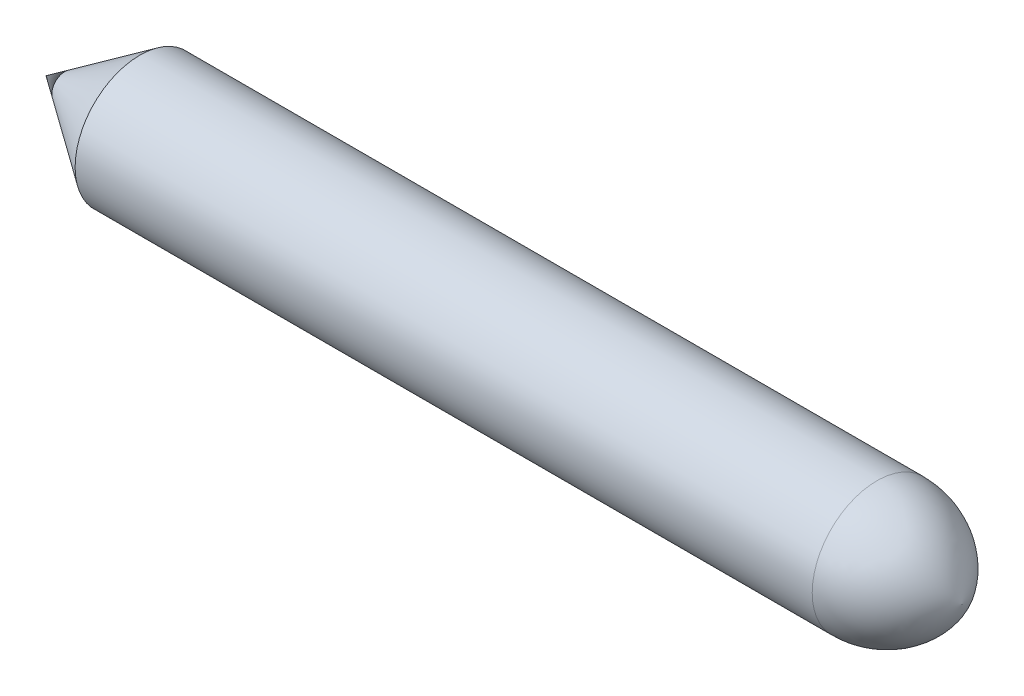
ISO-10303-21;
HEADER;
FILE_DESCRIPTION(('STEP AP214'),'2;1');
FILE_NAME('part.step','',(''),(''),'','','');
FILE_SCHEMA(('AUTOMOTIVE_DESIGN { 1 0 10303 214 1 1 1 1 }'));
ENDSEC;
DATA;
#1=APPLICATION_CONTEXT('core data for automotive mechanical design processes');
#2=APPLICATION_PROTOCOL_DEFINITION('international standard','automotive_design',2000,#1);
#3=PRODUCT_CONTEXT('',#1,'mechanical');
#4=PRODUCT('Part','Part','',(#3));
#5=PRODUCT_RELATED_PRODUCT_CATEGORY('part','',(#4));
#6=PRODUCT_DEFINITION_FORMATION('','',#4);
#7=PRODUCT_DEFINITION_CONTEXT('part definition',#1,'design');
#8=PRODUCT_DEFINITION('design','',#6,#7);
#9=PRODUCT_DEFINITION_SHAPE('','',#8);
#10=(LENGTH_UNIT() NAMED_UNIT(*) SI_UNIT(.MILLI.,.METRE.));
#11=(NAMED_UNIT(*) PLANE_ANGLE_UNIT() SI_UNIT($,.RADIAN.));
#12=(NAMED_UNIT(*) SI_UNIT($,.STERADIAN.) SOLID_ANGLE_UNIT());
#13=UNCERTAINTY_MEASURE_WITH_UNIT(LENGTH_MEASURE(1.E-05),#10,'distance_accuracy_value','');
#14=(GEOMETRIC_REPRESENTATION_CONTEXT(3) GLOBAL_UNCERTAINTY_ASSIGNED_CONTEXT((#13)) GLOBAL_UNIT_ASSIGNED_CONTEXT((#10,
#11,#12)) REPRESENTATION_CONTEXT('',''));
#15=CARTESIAN_POINT('',(0.,0.,0.));
#16=DIRECTION('',(0.,0.,1.));
#17=DIRECTION('',(1.,0.,0.));
#18=AXIS2_PLACEMENT_3D('',#15,#16,#17);
#19=CARTESIAN_POINT('',(7.66081896107437,0.,0.));
#20=DIRECTION('',(1.,0.,0.));
#21=DIRECTION('',(0.,0.,-1.));
#22=AXIS2_PLACEMENT_3D('',#19,#20,#21);
#23=CONICAL_SURFACE('',#22,5.28436784666359,0.603841717809268);
#24=CARTESIAN_POINT('',(0.,0.,0.));
#25=VERTEX_POINT('',#24);
#26=VERTEX_LOOP('',#25);
#27=FACE_BOUND('',#26,.T.);
#28=CARTESIAN_POINT('',(7.66081896107437,0.,0.));
#29=DIRECTION('',(-1.,0.,0.));
#30=DIRECTION('',(0.,0.,1.));
#31=AXIS2_PLACEMENT_3D('',#28,#29,#30);
#32=CIRCLE('',#31,5.28436784666359);
#33=CARTESIAN_POINT('',(7.66081896107437,0.,5.28436784666359));
#34=VERTEX_POINT('',#33);
#35=EDGE_CURVE('E11',#34,#34,#32,.T.);
#36=ORIENTED_EDGE('',*,*,#35,.T.);
#37=EDGE_LOOP('',(#36));
#38=FACE_BOUND('',#37,.T.);
#39=ADVANCED_FACE('F33',(#27,#38),#23,.T.);
#40=CARTESIAN_POINT('',(0.,0.,0.));
#41=DIRECTION('',(-1.,0.,0.));
#42=DIRECTION('',(0.,0.,1.));
#43=AXIS2_PLACEMENT_3D('',#40,#41,#42);
#44=CYLINDRICAL_SURFACE('',#43,5.28436784666359);
#45=ORIENTED_EDGE('',*,*,#35,.F.);
#46=EDGE_LOOP('',(#45));
#47=FACE_BOUND('',#46,.T.);
#48=CARTESIAN_POINT('',(67.8267363345445,0.,0.));
#49=DIRECTION('',(-1.,0.,0.));
#50=DIRECTION('',(0.,0.,1.));
#51=AXIS2_PLACEMENT_3D('',#48,#49,#50);
#52=CIRCLE('',#51,5.28436784666359);
#53=CARTESIAN_POINT('',(67.8267363345445,0.,5.28436784666359));
#54=VERTEX_POINT('',#53);
#55=EDGE_CURVE('E40',#54,#54,#52,.T.);
#56=ORIENTED_EDGE('',*,*,#55,.T.);
#57=EDGE_LOOP('',(#56));
#58=FACE_BOUND('',#57,.T.);
#59=ADVANCED_FACE('F48',(#47,#58),#44,.T.);
#60=CARTESIAN_POINT('',(67.8267363345445,0.,-1.88675204406087));
#61=DIRECTION('',(0.,-1.,0.));
#62=DIRECTION('',(0.,0.,1.));
#63=AXIS2_PLACEMENT_3D('',#60,#61,#62);
#64=CIRCLE('',#63,7.17111989072447);
#65=TRIMMED_CURVE('',#64,(PARAMETER_VALUE(-1.30455792495111)),
(PARAMETER_VALUE(1.30455792495111)),.T.,.PARAMETER.);
#66=CARTESIAN_POINT('',(67.8267363345445,0.,0.));
#67=DIRECTION('',(-1.,0.,0.));
#68=AXIS1_PLACEMENT('',#66,#67);
#69=SURFACE_OF_REVOLUTION('',#65,#68);
#70=ORIENTED_EDGE('',*,*,#55,.F.);
#71=EDGE_LOOP('',(#70));
#72=FACE_BOUND('',#71,.T.);
#73=CARTESIAN_POINT('',(74.7451991126027,0.,0.));
#74=VERTEX_POINT('',#73);
#75=VERTEX_LOOP('',#74);
#76=FACE_BOUND('',#75,.T.);
#77=ADVANCED_FACE('F53',(#72,#76),#69,.T.);
#78=CLOSED_SHELL('',(#39,#59,#77));
#79=MANIFOLD_SOLID_BREP('B2',#78);
#80=ADVANCED_BREP_SHAPE_REPRESENTATION('',(#18,#79),#14);
#81=SHAPE_DEFINITION_REPRESENTATION(#9,#80);
ENDSEC;
END-ISO-10303-21;
